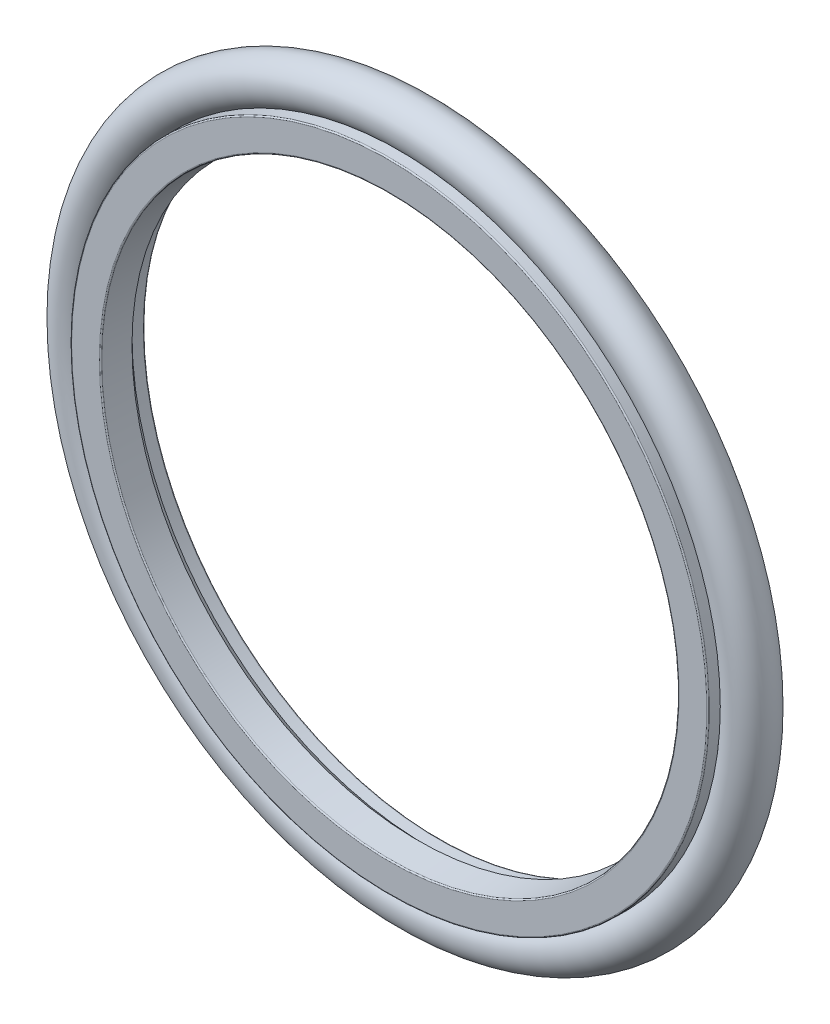
ISO-10303-21;
HEADER;
FILE_DESCRIPTION(('STEP AP214'),'2;1');
FILE_NAME('part.step','',(''),(''),'','','');
FILE_SCHEMA(('AUTOMOTIVE_DESIGN { 1 0 10303 214 1 1 1 1 }'));
ENDSEC;
DATA;
#1=APPLICATION_CONTEXT('core data for automotive mechanical design processes');
#2=APPLICATION_PROTOCOL_DEFINITION('international standard','automotive_design',2000,#1);
#3=PRODUCT_CONTEXT('',#1,'mechanical');
#4=PRODUCT('Part','Part','',(#3));
#5=PRODUCT_RELATED_PRODUCT_CATEGORY('part','',(#4));
#6=PRODUCT_DEFINITION_FORMATION('','',#4);
#7=PRODUCT_DEFINITION_CONTEXT('part definition',#1,'design');
#8=PRODUCT_DEFINITION('design','',#6,#7);
#9=PRODUCT_DEFINITION_SHAPE('','',#8);
#10=(LENGTH_UNIT() NAMED_UNIT(*) SI_UNIT(.MILLI.,.METRE.));
#11=(NAMED_UNIT(*) PLANE_ANGLE_UNIT() SI_UNIT($,.RADIAN.));
#12=(NAMED_UNIT(*) SI_UNIT($,.STERADIAN.) SOLID_ANGLE_UNIT());
#13=UNCERTAINTY_MEASURE_WITH_UNIT(LENGTH_MEASURE(1.E-05),#10,'distance_accuracy_value','');
#14=(GEOMETRIC_REPRESENTATION_CONTEXT(3) GLOBAL_UNCERTAINTY_ASSIGNED_CONTEXT((#13)) GLOBAL_UNIT_ASSIGNED_CONTEXT((#10,
#11,#12)) REPRESENTATION_CONTEXT('',''));
#15=CARTESIAN_POINT('',(0.,0.,0.));
#16=DIRECTION('',(0.,0.,1.));
#17=DIRECTION('',(1.,0.,0.));
#18=AXIS2_PLACEMENT_3D('',#15,#16,#17);
#19=CARTESIAN_POINT('',(0.,0.,1.95000000000001));
#20=DIRECTION('',(0.,0.,-1.));
#21=DIRECTION('',(-1.,0.,0.));
#22=AXIS2_PLACEMENT_3D('',#19,#20,#21);
#23=TOROIDAL_SURFACE('',#22,26.765,1.765);
#24=CARTESIAN_POINT('',(-28.53,0.,1.95000000000001));
#25=VERTEX_POINT('',#24);
#26=VERTEX_LOOP('',#25);
#27=FACE_BOUND('',#26,.T.);
#28=ADVANCED_FACE('F53',(#27),#23,.T.);
#29=CLOSED_SHELL('',(#28));
#30=MANIFOLD_SOLID_BREP('B2',#29);
#31=CARTESIAN_POINT('',(0.,0.,0.1));
#32=DIRECTION('',(0.,0.,-1.));
#33=DIRECTION('',(-1.,0.,0.));
#34=AXIS2_PLACEMENT_3D('',#31,#32,#33);
#35=TOROIDAL_SURFACE('',#34,23.55,0.099999999999998);
#36=CARTESIAN_POINT('',(0.,0.,0.));
#37=DIRECTION('',(0.,0.,-1.));
#38=DIRECTION('',(-1.,0.,0.));
#39=AXIS2_PLACEMENT_3D('',#36,#37,#38);
#40=CIRCLE('',#39,23.55);
#41=CARTESIAN_POINT('',(-23.55,0.,0.));
#42=VERTEX_POINT('',#41);
#43=EDGE_CURVE('E115',#42,#42,#40,.T.);
#44=ORIENTED_EDGE('',*,*,#43,.T.);
#45=EDGE_LOOP('',(#44));
#46=FACE_BOUND('',#45,.T.);
#47=CARTESIAN_POINT('',(0.,0.,0.1));
#48=DIRECTION('',(0.,0.,-1.));
#49=DIRECTION('',(-1.,0.,0.));
#50=AXIS2_PLACEMENT_3D('',#47,#48,#49);
#51=CIRCLE('',#50,23.45);
#52=CARTESIAN_POINT('',(-23.45,0.,0.1));
#53=VERTEX_POINT('',#52);
#54=EDGE_CURVE('E52',#53,#53,#51,.T.);
#55=ORIENTED_EDGE('',*,*,#54,.F.);
#56=EDGE_LOOP('',(#55));
#57=FACE_BOUND('',#56,.T.);
#58=ADVANCED_FACE('F70',(#46,#57),#35,.T.);
#59=CARTESIAN_POINT('',(0.,0.,0.));
#60=DIRECTION('',(0.,0.,-1.));
#61=DIRECTION('',(-1.,0.,0.));
#62=AXIS2_PLACEMENT_3D('',#59,#60,#61);
#63=CYLINDRICAL_SURFACE('',#62,23.45);
#64=ORIENTED_EDGE('',*,*,#54,.T.);
#65=EDGE_LOOP('',(#64));
#66=FACE_BOUND('',#65,.T.);
#67=CARTESIAN_POINT('',(0.,0.,1.));
#68=DIRECTION('',(0.,0.,-1.));
#69=DIRECTION('',(-1.,0.,0.));
#70=AXIS2_PLACEMENT_3D('',#67,#68,#69);
#71=CIRCLE('',#70,23.45);
#72=CARTESIAN_POINT('',(-23.45,0.,1.));
#73=VERTEX_POINT('',#72);
#74=EDGE_CURVE('E77',#73,#73,#71,.T.);
#75=ORIENTED_EDGE('',*,*,#74,.F.);
#76=EDGE_LOOP('',(#75));
#77=FACE_BOUND('',#76,.T.);
#78=ADVANCED_FACE('F135',(#66,#77),#63,.F.);
#79=CARTESIAN_POINT('',(0.,0.,1.7));
#80=DIRECTION('',(0.,0.,-1.));
#81=DIRECTION('',(-1.,0.,0.));
#82=AXIS2_PLACEMENT_3D('',#79,#80,#81);
#83=CONICAL_SURFACE('',#82,22.75,0.78539816339745);
#84=ORIENTED_EDGE('',*,*,#74,.T.);
#85=EDGE_LOOP('',(#84));
#86=FACE_BOUND('',#85,.T.);
#87=CARTESIAN_POINT('',(0.,0.,1.7));
#88=DIRECTION('',(0.,0.,-1.));
#89=DIRECTION('',(-1.,0.,0.));
#90=AXIS2_PLACEMENT_3D('',#87,#88,#89);
#91=CIRCLE('',#90,22.75);
#92=CARTESIAN_POINT('',(-22.75,0.,1.7));
#93=VERTEX_POINT('',#92);
#94=EDGE_CURVE('E83',#93,#93,#91,.T.);
#95=ORIENTED_EDGE('',*,*,#94,.F.);
#96=EDGE_LOOP('',(#95));
#97=FACE_BOUND('',#96,.T.);
#98=ADVANCED_FACE('F139',(#86,#97),#83,.F.);
#99=CARTESIAN_POINT('',(0.,0.,3.90866296163649));
#100=DIRECTION('',(0.,0.,1.));
#101=DIRECTION('',(1.,0.,0.));
#102=AXIS2_PLACEMENT_3D('',#99,#100,#101);
#103=CONICAL_SURFACE('',#102,22.942057648838,0.0867383386759878);
#104=ORIENTED_EDGE('',*,*,#94,.T.);
#105=EDGE_LOOP('',(#104));
#106=FACE_BOUND('',#105,.T.);
#107=CARTESIAN_POINT('',(0.,0.,3.90866296163649));
#108=DIRECTION('',(0.,0.,-1.));
#109=DIRECTION('',(-1.,0.,0.));
#110=AXIS2_PLACEMENT_3D('',#107,#108,#109);
#111=CIRCLE('',#110,22.942057648838);
#112=CARTESIAN_POINT('',(-22.942057648838,0.,3.90866296163649));
#113=VERTEX_POINT('',#112);
#114=EDGE_CURVE('E89',#113,#113,#111,.T.);
#115=ORIENTED_EDGE('',*,*,#114,.F.);
#116=EDGE_LOOP('',(#115));
#117=FACE_BOUND('',#116,.T.);
#118=ADVANCED_FACE('F143',(#106,#117),#103,.F.);
#119=CARTESIAN_POINT('',(0.,0.,3.9));
#120=DIRECTION('',(0.,0.,-1.));
#121=DIRECTION('',(-1.,0.,0.));
#122=AXIS2_PLACEMENT_3D('',#119,#120,#121);
#123=TOROIDAL_SURFACE('',#122,23.0416817076575,0.0999999999999955);
#124=ORIENTED_EDGE('',*,*,#114,.T.);
#125=EDGE_LOOP('',(#124));
#126=FACE_BOUND('',#125,.T.);
#127=CARTESIAN_POINT('',(0.,0.,4.));
#128=DIRECTION('',(0.,0.,-1.));
#129=DIRECTION('',(-1.,0.,0.));
#130=AXIS2_PLACEMENT_3D('',#127,#128,#129);
#131=CIRCLE('',#130,23.0416817076575);
#132=CARTESIAN_POINT('',(-23.0416817076575,0.,4.));
#133=VERTEX_POINT('',#132);
#134=EDGE_CURVE('E95',#133,#133,#131,.T.);
#135=ORIENTED_EDGE('',*,*,#134,.F.);
#136=EDGE_LOOP('',(#135));
#137=FACE_BOUND('',#136,.T.);
#138=ADVANCED_FACE('F149',(#126,#137),#123,.T.);
#139=CARTESIAN_POINT('',(0.,25.25,4.));
#140=DIRECTION('',(0.,0.,1.));
#141=DIRECTION('',(1.,0.,0.));
#142=AXIS2_PLACEMENT_3D('',#139,#140,#141);
#143=PLANE('',#142);
#144=ORIENTED_EDGE('',*,*,#134,.T.);
#145=EDGE_LOOP('',(#144));
#146=FACE_BOUND('',#145,.T.);
#147=CARTESIAN_POINT('',(0.,0.,4.));
#148=DIRECTION('',(0.,0.,-1.));
#149=DIRECTION('',(-1.,0.,0.));
#150=AXIS2_PLACEMENT_3D('',#147,#148,#149);
#151=CIRCLE('',#150,25.25);
#152=CARTESIAN_POINT('',(-25.25,0.,4.));
#153=VERTEX_POINT('',#152);
#154=EDGE_CURVE('E99',#153,#153,#151,.T.);
#155=ORIENTED_EDGE('',*,*,#154,.F.);
#156=EDGE_LOOP('',(#155));
#157=FACE_BOUND('',#156,.T.);
#158=ADVANCED_FACE('F153',(#146,#157),#143,.T.);
#159=CARTESIAN_POINT('',(0.,0.,3.9));
#160=DIRECTION('',(0.,0.,-1.));
#161=DIRECTION('',(-1.,0.,0.));
#162=AXIS2_PLACEMENT_3D('',#159,#160,#161);
#163=TOROIDAL_SURFACE('',#162,25.25,0.0999999999999974);
#164=ORIENTED_EDGE('',*,*,#154,.T.);
#165=EDGE_LOOP('',(#164));
#166=FACE_BOUND('',#165,.T.);
#167=CARTESIAN_POINT('',(0.,0.,3.9));
#168=DIRECTION('',(0.,0.,-1.));
#169=DIRECTION('',(-1.,0.,0.));
#170=AXIS2_PLACEMENT_3D('',#167,#168,#169);
#171=CIRCLE('',#170,25.35);
#172=CARTESIAN_POINT('',(-25.35,0.,3.9));
#173=VERTEX_POINT('',#172);
#174=EDGE_CURVE('E103',#173,#173,#171,.T.);
#175=ORIENTED_EDGE('',*,*,#174,.F.);
#176=EDGE_LOOP('',(#175));
#177=FACE_BOUND('',#176,.T.);
#178=ADVANCED_FACE('F157',(#166,#177),#163,.T.);
#179=CARTESIAN_POINT('',(0.,0.,0.));
#180=DIRECTION('',(0.,0.,-1.));
#181=DIRECTION('',(-1.,0.,0.));
#182=AXIS2_PLACEMENT_3D('',#179,#180,#181);
#183=CYLINDRICAL_SURFACE('',#182,25.35);
#184=ORIENTED_EDGE('',*,*,#174,.T.);
#185=EDGE_LOOP('',(#184));
#186=FACE_BOUND('',#185,.T.);
#187=CARTESIAN_POINT('',(0.,0.,0.1));
#188=DIRECTION('',(0.,0.,-1.));
#189=DIRECTION('',(-1.,0.,0.));
#190=AXIS2_PLACEMENT_3D('',#187,#188,#189);
#191=CIRCLE('',#190,25.35);
#192=CARTESIAN_POINT('',(-25.35,0.,0.1));
#193=VERTEX_POINT('',#192);
#194=EDGE_CURVE('E107',#193,#193,#191,.T.);
#195=ORIENTED_EDGE('',*,*,#194,.F.);
#196=EDGE_LOOP('',(#195));
#197=FACE_BOUND('',#196,.T.);
#198=ADVANCED_FACE('F131',(#186,#197),#183,.T.);
#199=CARTESIAN_POINT('',(0.,0.,0.1));
#200=DIRECTION('',(0.,0.,-1.));
#201=DIRECTION('',(-1.,0.,0.));
#202=AXIS2_PLACEMENT_3D('',#199,#200,#201);
#203=TOROIDAL_SURFACE('',#202,25.25,0.100000000000001);
#204=ORIENTED_EDGE('',*,*,#194,.T.);
#205=EDGE_LOOP('',(#204));
#206=FACE_BOUND('',#205,.T.);
#207=CARTESIAN_POINT('',(0.,0.,0.));
#208=DIRECTION('',(0.,0.,-1.));
#209=DIRECTION('',(-1.,0.,0.));
#210=AXIS2_PLACEMENT_3D('',#207,#208,#209);
#211=CIRCLE('',#210,25.25);
#212=CARTESIAN_POINT('',(-25.25,0.,0.));
#213=VERTEX_POINT('',#212);
#214=EDGE_CURVE('E111',#213,#213,#211,.T.);
#215=ORIENTED_EDGE('',*,*,#214,.F.);
#216=EDGE_LOOP('',(#215));
#217=FACE_BOUND('',#216,.T.);
#218=ADVANCED_FACE('F125',(#206,#217),#203,.T.);
#219=CARTESIAN_POINT('',(0.,23.55,0.));
#220=DIRECTION('',(0.,0.,-1.));
#221=DIRECTION('',(-1.,0.,0.));
#222=AXIS2_PLACEMENT_3D('',#219,#220,#221);
#223=PLANE('',#222);
#224=ORIENTED_EDGE('',*,*,#214,.T.);
#225=EDGE_LOOP('',(#224));
#226=FACE_BOUND('',#225,.T.);
#227=ORIENTED_EDGE('',*,*,#43,.F.);
#228=EDGE_LOOP('',(#227));
#229=FACE_BOUND('',#228,.T.);
#230=ADVANCED_FACE('F123',(#226,#229),#223,.T.);
#231=CLOSED_SHELL('',(#58,#78,#98,#118,#138,#158,#178,#198,#218,#230));
#232=MANIFOLD_SOLID_BREP('B6',#231);
#233=ADVANCED_BREP_SHAPE_REPRESENTATION('',(#18,#30,#232),#14);
#234=SHAPE_DEFINITION_REPRESENTATION(#9,#233);
ENDSEC;
END-ISO-10303-21;
